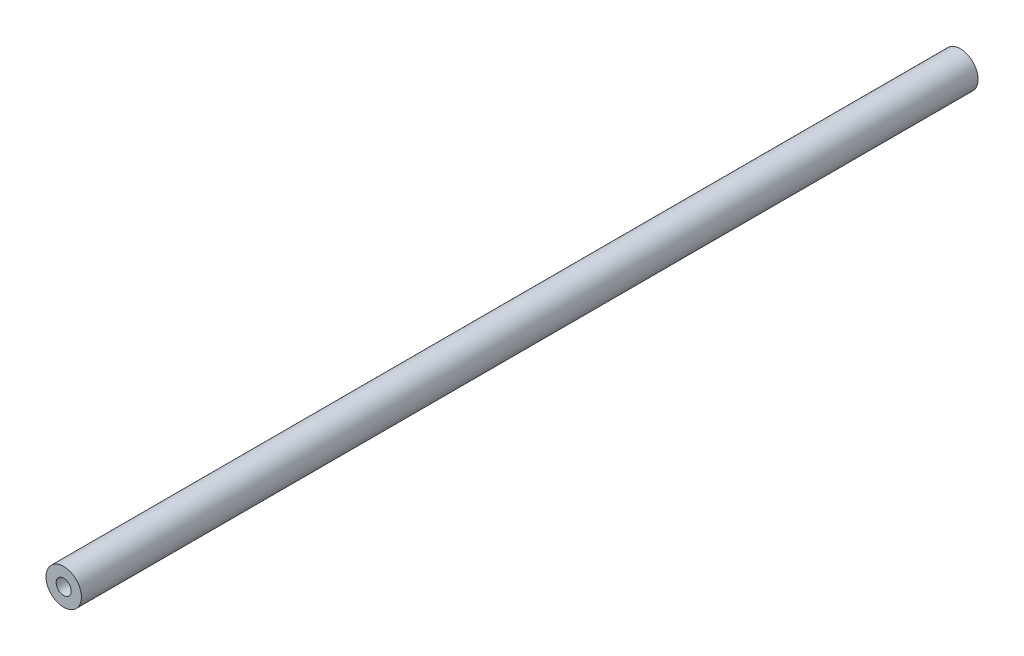
ISO-10303-21;
HEADER;
FILE_DESCRIPTION(('STEP AP214'),'2;1');
FILE_NAME('part.step','',(''),(''),'','','');
FILE_SCHEMA(('AUTOMOTIVE_DESIGN { 1 0 10303 214 1 1 1 1 }'));
ENDSEC;
DATA;
#1=APPLICATION_CONTEXT('core data for automotive mechanical design processes');
#2=APPLICATION_PROTOCOL_DEFINITION('international standard','automotive_design',2000,#1);
#3=PRODUCT_CONTEXT('',#1,'mechanical');
#4=PRODUCT('Part','Part','',(#3));
#5=PRODUCT_RELATED_PRODUCT_CATEGORY('part','',(#4));
#6=PRODUCT_DEFINITION_FORMATION('','',#4);
#7=PRODUCT_DEFINITION_CONTEXT('part definition',#1,'design');
#8=PRODUCT_DEFINITION('design','',#6,#7);
#9=PRODUCT_DEFINITION_SHAPE('','',#8);
#10=(LENGTH_UNIT() NAMED_UNIT(*) SI_UNIT(.MILLI.,.METRE.));
#11=(NAMED_UNIT(*) PLANE_ANGLE_UNIT() SI_UNIT($,.RADIAN.));
#12=(NAMED_UNIT(*) SI_UNIT($,.STERADIAN.) SOLID_ANGLE_UNIT());
#13=UNCERTAINTY_MEASURE_WITH_UNIT(LENGTH_MEASURE(1.E-05),#10,'distance_accuracy_value','');
#14=(GEOMETRIC_REPRESENTATION_CONTEXT(3) GLOBAL_UNCERTAINTY_ASSIGNED_CONTEXT((#13)) GLOBAL_UNIT_ASSIGNED_CONTEXT((#10,
#11,#12)) REPRESENTATION_CONTEXT('',''));
#15=CARTESIAN_POINT('',(0.,0.,0.));
#16=DIRECTION('',(0.,0.,1.));
#17=DIRECTION('',(1.,0.,0.));
#18=AXIS2_PLACEMENT_3D('',#15,#16,#17);
#19=CARTESIAN_POINT('',(0.,0.,120.65));
#20=DIRECTION('',(0.,0.,-1.));
#21=DIRECTION('',(-1.,0.,0.));
#22=AXIS2_PLACEMENT_3D('',#19,#20,#21);
#23=CYLINDRICAL_SURFACE('',#22,4.7625);
#24=CARTESIAN_POINT('',(0.,0.,120.65));
#25=DIRECTION('',(0.,0.,1.));
#26=DIRECTION('',(1.,0.,0.));
#27=AXIS2_PLACEMENT_3D('',#24,#25,#26);
#28=CIRCLE('',#27,4.7625);
#29=CARTESIAN_POINT('',(-4.7625,0.,120.65));
#30=VERTEX_POINT('',#29);
#31=EDGE_CURVE('E11',#30,#30,#28,.T.);
#32=CARTESIAN_POINT('',(0.,0.,-120.65));
#33=DIRECTION('',(0.,0.,1.));
#34=DIRECTION('',(1.,0.,0.));
#35=AXIS2_PLACEMENT_3D('',#32,#33,#34);
#36=CIRCLE('',#35,4.7625);
#37=CARTESIAN_POINT('',(-4.7625,0.,-120.65));
#38=VERTEX_POINT('',#37);
#39=EDGE_CURVE('E44',#38,#38,#36,.T.);
#40=CARTESIAN_POINT('',(-4.7625,0.,120.65));
#41=CARTESIAN_POINT('',(-4.7625,0.,118.136458333333));
#42=CARTESIAN_POINT('',(-4.7625,0.,115.622916666667));
#43=CARTESIAN_POINT('',(-4.7625,0.,110.595833333333));
#44=CARTESIAN_POINT('',(-4.7625,0.,108.082291666667));
#45=CARTESIAN_POINT('',(-4.7625,0.,103.055208333333));
#46=CARTESIAN_POINT('',(-4.7625,0.,100.541666666667));
#47=CARTESIAN_POINT('',(-4.7625,0.,95.5145833333333));
#48=CARTESIAN_POINT('',(-4.7625,0.,93.0010416666667));
#49=CARTESIAN_POINT('',(-4.7625,0.,87.9739583333333));
#50=CARTESIAN_POINT('',(-4.7625,0.,85.4604166666666));
#51=CARTESIAN_POINT('',(-4.7625,0.,80.4333333333333));
#52=CARTESIAN_POINT('',(-4.7625,0.,77.9197916666667));
#53=CARTESIAN_POINT('',(-4.7625,0.,72.8927083333333));
#54=CARTESIAN_POINT('',(-4.7625,0.,70.3791666666667));
#55=CARTESIAN_POINT('',(-4.7625,0.,65.3520833333333));
#56=CARTESIAN_POINT('',(-4.7625,0.,62.8385416666667));
#57=CARTESIAN_POINT('',(-4.7625,0.,57.8114583333333));
#58=CARTESIAN_POINT('',(-4.7625,0.,55.2979166666667));
#59=CARTESIAN_POINT('',(-4.7625,0.,50.2708333333333));
#60=CARTESIAN_POINT('',(-4.7625,0.,47.7572916666667));
#61=CARTESIAN_POINT('',(-4.7625,0.,42.7302083333333));
#62=CARTESIAN_POINT('',(-4.7625,0.,40.2166666666667));
#63=CARTESIAN_POINT('',(-4.7625,0.,35.1895833333333));
#64=CARTESIAN_POINT('',(-4.7625,0.,32.6760416666667));
#65=CARTESIAN_POINT('',(-4.7625,0.,27.6489583333333));
#66=CARTESIAN_POINT('',(-4.7625,0.,25.1354166666667));
#67=CARTESIAN_POINT('',(-4.7625,0.,20.1083333333333));
#68=CARTESIAN_POINT('',(-4.7625,0.,17.5947916666667));
#69=CARTESIAN_POINT('',(-4.7625,0.,12.5677083333333));
#70=CARTESIAN_POINT('',(-4.7625,0.,10.0541666666667));
#71=CARTESIAN_POINT('',(-4.7625,0.,5.02708333333333));
#72=CARTESIAN_POINT('',(-4.7625,0.,2.51354166666667));
#73=CARTESIAN_POINT('',(-4.7625,0.,-2.51354166666666));
#74=CARTESIAN_POINT('',(-4.7625,0.,-5.02708333333332));
#75=CARTESIAN_POINT('',(-4.7625,0.,-10.0541666666666));
#76=CARTESIAN_POINT('',(-4.7625,0.,-12.5677083333333));
#77=CARTESIAN_POINT('',(-4.7625,0.,-17.5947916666667));
#78=CARTESIAN_POINT('',(-4.7625,0.,-20.1083333333333));
#79=CARTESIAN_POINT('',(-4.7625,0.,-25.1354166666667));
#80=CARTESIAN_POINT('',(-4.7625,0.,-27.6489583333333));
#81=CARTESIAN_POINT('',(-4.7625,0.,-32.6760416666667));
#82=CARTESIAN_POINT('',(-4.7625,0.,-35.1895833333333));
#83=CARTESIAN_POINT('',(-4.7625,0.,-40.2166666666667));
#84=CARTESIAN_POINT('',(-4.7625,0.,-42.7302083333333));
#85=CARTESIAN_POINT('',(-4.7625,0.,-47.7572916666667));
#86=CARTESIAN_POINT('',(-4.7625,0.,-50.2708333333333));
#87=CARTESIAN_POINT('',(-4.7625,0.,-55.2979166666667));
#88=CARTESIAN_POINT('',(-4.7625,0.,-57.8114583333333));
#89=CARTESIAN_POINT('',(-4.7625,0.,-62.8385416666667));
#90=CARTESIAN_POINT('',(-4.7625,0.,-65.3520833333333));
#91=CARTESIAN_POINT('',(-4.7625,0.,-70.3791666666667));
#92=CARTESIAN_POINT('',(-4.7625,0.,-72.8927083333333));
#93=CARTESIAN_POINT('',(-4.7625,0.,-77.9197916666667));
#94=CARTESIAN_POINT('',(-4.7625,0.,-80.4333333333333));
#95=CARTESIAN_POINT('',(-4.7625,0.,-85.4604166666666));
#96=CARTESIAN_POINT('',(-4.7625,0.,-87.9739583333333));
#97=CARTESIAN_POINT('',(-4.7625,0.,-93.0010416666667));
#98=CARTESIAN_POINT('',(-4.7625,0.,-95.5145833333333));
#99=CARTESIAN_POINT('',(-4.7625,0.,-100.541666666667));
#100=CARTESIAN_POINT('',(-4.7625,0.,-103.055208333333));
#101=CARTESIAN_POINT('',(-4.7625,0.,-108.082291666667));
#102=CARTESIAN_POINT('',(-4.7625,0.,-110.595833333333));
#103=CARTESIAN_POINT('',(-4.7625,0.,-115.622916666667));
#104=CARTESIAN_POINT('',(-4.7625,0.,-118.136458333333));
#105=CARTESIAN_POINT('',(-4.7625,0.,-120.65));
#106=B_SPLINE_CURVE_WITH_KNOTS('',3,(#40,#41,#42,#43,#44,#45,#46,#47,#48,#49,#50,#51,#52,#53,
#54,#55,#56,#57,#58,#59,#60,#61,#62,#63,#64,#65,#66,#67,#68,#69,#70,#71,#72,#73,#74,#75,#76,#77,
#78,#79,#80,#81,#82,#83,#84,#85,#86,#87,#88,#89,#90,#91,#92,#93,#94,#95,#96,#97,#98,#99,#100,
#101,#102,#103,#104,#105),.UNSPECIFIED.,.F.,.F.,(4,2,2,2,2,2,2,2,2,2,2,2,2,2,2,2,2,2,2,2,2,2,2,
2,2,2,2,2,2,2,2,2,4),(0.,7.54062500000001,15.08125,22.621875,30.1625,37.703125,45.24375,
52.784375,60.325,67.865625,75.40625,82.946875,90.4875,98.028125,105.56875,113.109375,120.65,
128.190625,135.73125,143.271875,150.8125,158.353125,165.89375,173.434375,180.975,188.515625,
196.05625,203.596875,211.1375,218.678125,226.21875,233.759375,241.3),.UNSPECIFIED.);
#107=EDGE_CURVE('BSEAM41',#30,#38,#106,.T.);
#108=ORIENTED_EDGE('',*,*,#31,.F.);
#109=ORIENTED_EDGE('',*,*,#39,.T.);
#110=ORIENTED_EDGE('',*,*,#107,.T.);
#111=ORIENTED_EDGE('',*,*,#107,.F.);
#112=EDGE_LOOP('',(#108,#110,#109,#111));
#113=FACE_BOUND('',#112,.T.);
#114=ADVANCED_FACE('F41',(#113),#23,.T.);
#115=CARTESIAN_POINT('',(0.,0.,120.65));
#116=DIRECTION('',(0.,0.,1.));
#117=DIRECTION('',(1.,0.,0.));
#118=AXIS2_PLACEMENT_3D('',#115,#116,#117);
#119=PLANE('',#118);
#120=CARTESIAN_POINT('',(0.,0.,120.65));
#121=DIRECTION('',(0.,0.,1.));
#122=DIRECTION('',(1.,0.,0.));
#123=AXIS2_PLACEMENT_3D('',#120,#121,#122);
#124=CIRCLE('',#123,2.01929999999999);
#125=CARTESIAN_POINT('',(2.01929999999999,0.,120.65));
#126=VERTEX_POINT('',#125);
#127=EDGE_CURVE('E65',#126,#126,#124,.T.);
#128=ORIENTED_EDGE('',*,*,#127,.F.);
#129=EDGE_LOOP('',(#128));
#130=FACE_BOUND('',#129,.T.);
#131=ORIENTED_EDGE('',*,*,#31,.T.);
#132=EDGE_LOOP('',(#131));
#133=FACE_BOUND('',#132,.T.);
#134=ADVANCED_FACE('F83',(#130,#133),#119,.T.);
#135=CARTESIAN_POINT('',(0.,0.,-120.65));
#136=DIRECTION('',(0.,0.,1.));
#137=DIRECTION('',(1.,0.,0.));
#138=AXIS2_PLACEMENT_3D('',#135,#136,#137);
#139=PLANE('',#138);
#140=CARTESIAN_POINT('',(0.,0.,-120.65));
#141=DIRECTION('',(0.,0.,-1.));
#142=DIRECTION('',(-1.,0.,0.));
#143=AXIS2_PLACEMENT_3D('',#140,#141,#142);
#144=CIRCLE('',#143,2.01929999999999);
#145=CARTESIAN_POINT('',(-2.01929999999999,0.,-120.65));
#146=VERTEX_POINT('',#145);
#147=EDGE_CURVE('E64',#146,#146,#144,.T.);
#148=ORIENTED_EDGE('',*,*,#147,.F.);
#149=EDGE_LOOP('',(#148));
#150=FACE_BOUND('',#149,.T.);
#151=ORIENTED_EDGE('',*,*,#39,.F.);
#152=EDGE_LOOP('',(#151));
#153=FACE_BOUND('',#152,.T.);
#154=ADVANCED_FACE('F80',(#150,#153),#139,.F.);
#155=CARTESIAN_POINT('',(0.,0.,-108.712));
#156=DIRECTION('',(0.,0.,-1.));
#157=DIRECTION('',(-1.,0.,0.));
#158=AXIS2_PLACEMENT_3D('',#155,#156,#157);
#159=CONICAL_SURFACE('',#158,2.01929999999999,1.02974425867665);
#160=CARTESIAN_POINT('',(0.,0.,-107.498682151998));
#161=VERTEX_POINT('',#160);
#162=VERTEX_LOOP('',#161);
#163=FACE_BOUND('',#162,.T.);
#164=CARTESIAN_POINT('',(0.,0.,-108.712));
#165=DIRECTION('',(0.,0.,-1.));
#166=DIRECTION('',(-1.,0.,0.));
#167=AXIS2_PLACEMENT_3D('',#164,#165,#166);
#168=CIRCLE('',#167,2.01929999999999);
#169=CARTESIAN_POINT('',(-2.01929999999999,0.,-108.712));
#170=VERTEX_POINT('',#169);
#171=EDGE_CURVE('E68',#170,#170,#168,.T.);
#172=ORIENTED_EDGE('',*,*,#171,.T.);
#173=EDGE_LOOP('',(#172));
#174=FACE_BOUND('',#173,.T.);
#175=ADVANCED_FACE('F82',(#163,#174),#159,.F.);
#176=CARTESIAN_POINT('',(0.,0.,-120.65));
#177=DIRECTION('',(0.,0.,-1.));
#178=DIRECTION('',(-1.,0.,0.));
#179=AXIS2_PLACEMENT_3D('',#176,#177,#178);
#180=CYLINDRICAL_SURFACE('',#179,2.01929999999999);
#181=ORIENTED_EDGE('',*,*,#171,.F.);
#182=EDGE_LOOP('',(#181));
#183=FACE_BOUND('',#182,.T.);
#184=ORIENTED_EDGE('',*,*,#147,.T.);
#185=EDGE_LOOP('',(#184));
#186=FACE_BOUND('',#185,.T.);
#187=ADVANCED_FACE('F58',(#183,#186),#180,.F.);
#188=CARTESIAN_POINT('',(0.,0.,108.712));
#189=DIRECTION('',(0.,0.,1.));
#190=DIRECTION('',(1.,0.,0.));
#191=AXIS2_PLACEMENT_3D('',#188,#189,#190);
#192=CONICAL_SURFACE('',#191,2.01929999999999,1.02974425867665);
#193=CARTESIAN_POINT('',(0.,0.,107.498682151998));
#194=VERTEX_POINT('',#193);
#195=VERTEX_LOOP('',#194);
#196=FACE_BOUND('',#195,.T.);
#197=CARTESIAN_POINT('',(0.,0.,108.712));
#198=DIRECTION('',(0.,0.,1.));
#199=DIRECTION('',(1.,0.,0.));
#200=AXIS2_PLACEMENT_3D('',#197,#198,#199);
#201=CIRCLE('',#200,2.01929999999999);
#202=CARTESIAN_POINT('',(2.01929999999999,0.,108.712));
#203=VERTEX_POINT('',#202);
#204=EDGE_CURVE('E62',#203,#203,#201,.T.);
#205=ORIENTED_EDGE('',*,*,#204,.T.);
#206=EDGE_LOOP('',(#205));
#207=FACE_BOUND('',#206,.T.);
#208=ADVANCED_FACE('F54',(#196,#207),#192,.F.);
#209=CARTESIAN_POINT('',(0.,0.,120.65));
#210=DIRECTION('',(0.,0.,1.));
#211=DIRECTION('',(1.,0.,0.));
#212=AXIS2_PLACEMENT_3D('',#209,#210,#211);
#213=CYLINDRICAL_SURFACE('',#212,2.01929999999999);
#214=ORIENTED_EDGE('',*,*,#204,.F.);
#215=EDGE_LOOP('',(#214));
#216=FACE_BOUND('',#215,.T.);
#217=ORIENTED_EDGE('',*,*,#127,.T.);
#218=EDGE_LOOP('',(#217));
#219=FACE_BOUND('',#218,.T.);
#220=ADVANCED_FACE('F57',(#216,#219),#213,.F.);
#221=CLOSED_SHELL('',(#114,#134,#154,#175,#187,#208,#220));
#222=MANIFOLD_SOLID_BREP('B2',#221);
#223=ADVANCED_BREP_SHAPE_REPRESENTATION('',(#18,#222),#14);
#224=SHAPE_DEFINITION_REPRESENTATION(#9,#223);
ENDSEC;
END-ISO-10303-21;
